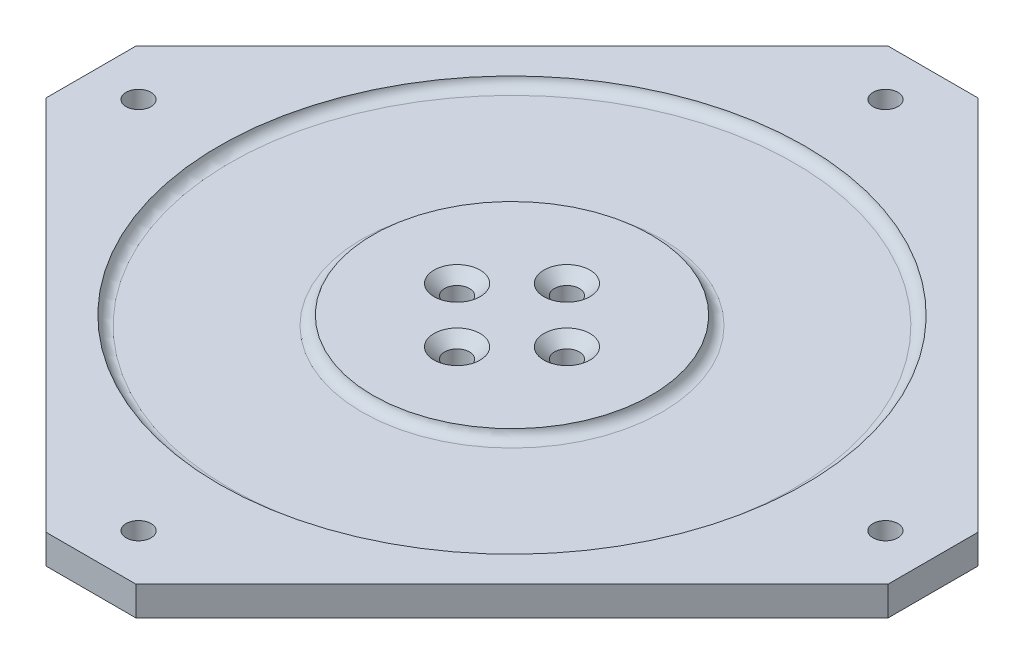
ISO-10303-21;
HEADER;
FILE_DESCRIPTION(('STEP AP214'),'2;1');
FILE_NAME('part.step','',(''),(''),'','','');
FILE_SCHEMA(('AUTOMOTIVE_DESIGN { 1 0 10303 214 1 1 1 1 }'));
ENDSEC;
DATA;
#1=APPLICATION_CONTEXT('core data for automotive mechanical design processes');
#2=APPLICATION_PROTOCOL_DEFINITION('international standard','automotive_design',2000,#1);
#3=PRODUCT_CONTEXT('',#1,'mechanical');
#4=PRODUCT('Part','Part','',(#3));
#5=PRODUCT_RELATED_PRODUCT_CATEGORY('part','',(#4));
#6=PRODUCT_DEFINITION_FORMATION('','',#4);
#7=PRODUCT_DEFINITION_CONTEXT('part definition',#1,'design');
#8=PRODUCT_DEFINITION('design','',#6,#7);
#9=PRODUCT_DEFINITION_SHAPE('','',#8);
#10=(LENGTH_UNIT() NAMED_UNIT(*) SI_UNIT(.MILLI.,.METRE.));
#11=(NAMED_UNIT(*) PLANE_ANGLE_UNIT() SI_UNIT($,.RADIAN.));
#12=(NAMED_UNIT(*) SI_UNIT($,.STERADIAN.) SOLID_ANGLE_UNIT());
#13=UNCERTAINTY_MEASURE_WITH_UNIT(LENGTH_MEASURE(1.E-05),#10,'distance_accuracy_value','');
#14=(GEOMETRIC_REPRESENTATION_CONTEXT(3) GLOBAL_UNCERTAINTY_ASSIGNED_CONTEXT((#13)) GLOBAL_UNIT_ASSIGNED_CONTEXT((#10,
#11,#12)) REPRESENTATION_CONTEXT('',''));
#15=CARTESIAN_POINT('',(0.,0.,0.));
#16=DIRECTION('',(0.,0.,1.));
#17=DIRECTION('',(1.,0.,0.));
#18=AXIS2_PLACEMENT_3D('',#15,#16,#17);
#19=CARTESIAN_POINT('',(0.,0.,0.));
#20=DIRECTION('',(0.,-1.,0.));
#21=DIRECTION('',(0.,0.,-1.));
#22=AXIS2_PLACEMENT_3D('',#19,#20,#21);
#23=PLANE('',#22);
#24=CARTESIAN_POINT('',(-7.5,0.,0.));
#25=DIRECTION('',(0.,1.,0.));
#26=DIRECTION('',(0.,0.,1.));
#27=AXIS2_PLACEMENT_3D('',#24,#25,#26);
#28=CIRCLE('',#27,1.7);
#29=CARTESIAN_POINT('',(-7.5,0.,1.70000000000001));
#30=VERTEX_POINT('',#29);
#31=EDGE_CURVE('E230',#30,#30,#28,.T.);
#32=ORIENTED_EDGE('',*,*,#31,.T.);
#33=EDGE_LOOP('',(#32));
#34=FACE_BOUND('',#33,.T.);
#35=CARTESIAN_POINT('',(0.,0.,7.50000000000001));
#36=DIRECTION('',(0.,1.,0.));
#37=DIRECTION('',(0.,0.,1.));
#38=AXIS2_PLACEMENT_3D('',#35,#36,#37);
#39=CIRCLE('',#38,1.7);
#40=CARTESIAN_POINT('',(0.,0.,9.20000000000001));
#41=VERTEX_POINT('',#40);
#42=EDGE_CURVE('E221',#41,#41,#39,.T.);
#43=ORIENTED_EDGE('',*,*,#42,.T.);
#44=EDGE_LOOP('',(#43));
#45=FACE_BOUND('',#44,.T.);
#46=CARTESIAN_POINT('',(7.5,0.,0.));
#47=DIRECTION('',(0.,1.,0.));
#48=DIRECTION('',(0.,0.,1.));
#49=AXIS2_PLACEMENT_3D('',#46,#47,#48);
#50=CIRCLE('',#49,1.7);
#51=CARTESIAN_POINT('',(7.5,0.,1.7));
#52=VERTEX_POINT('',#51);
#53=EDGE_CURVE('E212',#52,#52,#50,.T.);
#54=ORIENTED_EDGE('',*,*,#53,.T.);
#55=EDGE_LOOP('',(#54));
#56=FACE_BOUND('',#55,.T.);
#57=CARTESIAN_POINT('',(0.,0.,-7.5));
#58=DIRECTION('',(0.,1.,0.));
#59=DIRECTION('',(0.,0.,1.));
#60=AXIS2_PLACEMENT_3D('',#57,#58,#59);
#61=CIRCLE('',#60,1.7);
#62=CARTESIAN_POINT('',(0.,0.,-5.8));
#63=VERTEX_POINT('',#62);
#64=EDGE_CURVE('E203',#63,#63,#61,.T.);
#65=ORIENTED_EDGE('',*,*,#64,.T.);
#66=EDGE_LOOP('',(#65));
#67=FACE_BOUND('',#66,.T.);
#68=CARTESIAN_POINT('',(0.,0.,0.));
#69=DIRECTION('',(0.,-1.,0.));
#70=DIRECTION('',(0.,0.,-1.));
#71=AXIS2_PLACEMENT_3D('',#68,#69,#70);
#72=CIRCLE('',#71,19.);
#73=CARTESIAN_POINT('',(0.,0.,-19.));
#74=VERTEX_POINT('',#73);
#75=EDGE_CURVE('E166',#74,#74,#72,.T.);
#76=ORIENTED_EDGE('',*,*,#75,.T.);
#77=EDGE_LOOP('',(#76));
#78=FACE_BOUND('',#77,.T.);
#79=ADVANCED_FACE('F42',(#34,#45,#56,#67,#78),#23,.T.);
#80=CARTESIAN_POINT('',(0.,4.,0.));
#81=DIRECTION('',(0.,-1.,0.));
#82=DIRECTION('',(0.,0.,-1.));
#83=AXIS2_PLACEMENT_3D('',#80,#81,#82);
#84=PLANE('',#83);
#85=CARTESIAN_POINT('',(0.,4.,-7.5));
#86=DIRECTION('',(0.,1.,0.));
#87=DIRECTION('',(0.,0.,1.));
#88=AXIS2_PLACEMENT_3D('',#85,#86,#87);
#89=CIRCLE('',#88,3.15);
#90=CARTESIAN_POINT('',(0.,4.,-4.35));
#91=VERTEX_POINT('',#90);
#92=EDGE_CURVE('E197',#91,#91,#89,.T.);
#93=ORIENTED_EDGE('',*,*,#92,.F.);
#94=EDGE_LOOP('',(#93));
#95=FACE_BOUND('',#94,.T.);
#96=CARTESIAN_POINT('',(7.5,4.,0.));
#97=DIRECTION('',(0.,1.,0.));
#98=DIRECTION('',(0.,0.,1.));
#99=AXIS2_PLACEMENT_3D('',#96,#97,#98);
#100=CIRCLE('',#99,3.15);
#101=CARTESIAN_POINT('',(7.5,4.,3.15));
#102=VERTEX_POINT('',#101);
#103=EDGE_CURVE('E206',#102,#102,#100,.T.);
#104=ORIENTED_EDGE('',*,*,#103,.F.);
#105=EDGE_LOOP('',(#104));
#106=FACE_BOUND('',#105,.T.);
#107=CARTESIAN_POINT('',(0.,4.,7.50000000000001));
#108=DIRECTION('',(0.,1.,0.));
#109=DIRECTION('',(0.,0.,1.));
#110=AXIS2_PLACEMENT_3D('',#107,#108,#109);
#111=CIRCLE('',#110,3.15);
#112=CARTESIAN_POINT('',(0.,4.,10.65));
#113=VERTEX_POINT('',#112);
#114=EDGE_CURVE('E215',#113,#113,#111,.T.);
#115=ORIENTED_EDGE('',*,*,#114,.F.);
#116=EDGE_LOOP('',(#115));
#117=FACE_BOUND('',#116,.T.);
#118=CARTESIAN_POINT('',(-7.5,4.,0.));
#119=DIRECTION('',(0.,1.,0.));
#120=DIRECTION('',(0.,0.,1.));
#121=AXIS2_PLACEMENT_3D('',#118,#119,#120);
#122=CIRCLE('',#121,3.15);
#123=CARTESIAN_POINT('',(-7.5,4.,3.15000000000001));
#124=VERTEX_POINT('',#123);
#125=EDGE_CURVE('E224',#124,#124,#122,.T.);
#126=ORIENTED_EDGE('',*,*,#125,.F.);
#127=EDGE_LOOP('',(#126));
#128=FACE_BOUND('',#127,.T.);
#129=CARTESIAN_POINT('',(0.,4.,0.));
#130=DIRECTION('',(0.,1.,0.));
#131=DIRECTION('',(0.,0.,1.));
#132=AXIS2_PLACEMENT_3D('',#129,#130,#131);
#133=CIRCLE('',#132,19.);
#134=CARTESIAN_POINT('',(0.,4.,19.));
#135=VERTEX_POINT('',#134);
#136=EDGE_CURVE('E158',#135,#135,#133,.T.);
#137=ORIENTED_EDGE('',*,*,#136,.T.);
#138=EDGE_LOOP('',(#137));
#139=FACE_BOUND('',#138,.T.);
#140=ADVANCED_FACE('F308',(#95,#106,#117,#128,#139),#84,.F.);
#141=CARTESIAN_POINT('',(-63.6396103067893,4.,0.));
#142=DIRECTION('',(0.707106781186547,0.,0.707106781186547));
#143=DIRECTION('',(0.707106781186548,0.,-0.707106781186548));
#144=AXIS2_PLACEMENT_3D('',#141,#142,#143);
#145=PLANE('',#144);
#146=DIRECTION('',(-0.707106781186547,0.,0.707106781186547));
#147=VECTOR('',#146,1.);
#148=CARTESIAN_POINT('',(-63.6396103067893,4.,0.));
#149=LINE('',#148,#147);
#150=CARTESIAN_POINT('',(-6.13961030678925,4.,-57.5));
#151=VERTEX_POINT('',#150);
#152=CARTESIAN_POINT('',(-57.5,4.,-6.13961030678925));
#153=VERTEX_POINT('',#152);
#154=EDGE_CURVE('E133',#151,#153,#149,.T.);
#155=ORIENTED_EDGE('',*,*,#154,.F.);
#156=DIRECTION('',(0.,-1.,0.));
#157=VECTOR('',#156,1.);
#158=CARTESIAN_POINT('',(-6.13961030678925,4.,-57.5));
#159=LINE('',#158,#157);
#160=CARTESIAN_POINT('',(-6.13961030678925,0.,-57.5));
#161=VERTEX_POINT('',#160);
#162=EDGE_CURVE('E187',#151,#161,#159,.T.);
#163=ORIENTED_EDGE('',*,*,#162,.T.);
#164=DIRECTION('',(-0.707106781186547,0.,0.707106781186547));
#165=VECTOR('',#164,1.);
#166=CARTESIAN_POINT('',(-63.6396103067893,0.,0.));
#167=LINE('',#166,#165);
#168=CARTESIAN_POINT('',(-57.5,0.,-6.13961030678925));
#169=VERTEX_POINT('',#168);
#170=EDGE_CURVE('E135',#161,#169,#167,.T.);
#171=ORIENTED_EDGE('',*,*,#170,.T.);
#172=DIRECTION('',(0.,1.,0.));
#173=VECTOR('',#172,1.);
#174=CARTESIAN_POINT('',(-57.5,4.,-6.13961030678925));
#175=LINE('',#174,#173);
#176=EDGE_CURVE('E178',#169,#153,#175,.T.);
#177=ORIENTED_EDGE('',*,*,#176,.T.);
#178=EDGE_LOOP('',(#155,#163,#171,#177));
#179=FACE_BOUND('',#178,.T.);
#180=ADVANCED_FACE('F280',(#179),#145,.F.);
#181=CARTESIAN_POINT('',(-63.6396103067893,4.,0.));
#182=DIRECTION('',(0.707106781186547,0.,-0.707106781186547));
#183=DIRECTION('',(-0.707106781186548,0.,-0.707106781186548));
#184=AXIS2_PLACEMENT_3D('',#181,#182,#183);
#185=PLANE('',#184);
#186=DIRECTION('',(0.707106781186547,0.,0.707106781186547));
#187=VECTOR('',#186,1.);
#188=CARTESIAN_POINT('',(-63.6396103067893,4.,0.));
#189=LINE('',#188,#187);
#190=CARTESIAN_POINT('',(-57.5,4.,6.13961030678929));
#191=VERTEX_POINT('',#190);
#192=CARTESIAN_POINT('',(-6.13961030678931,4.,57.5));
#193=VERTEX_POINT('',#192);
#194=EDGE_CURVE('E271',#191,#193,#189,.T.);
#195=ORIENTED_EDGE('',*,*,#194,.F.);
#196=DIRECTION('',(0.,-1.,0.));
#197=VECTOR('',#196,1.);
#198=CARTESIAN_POINT('',(-57.5,4.,6.13961030678929));
#199=LINE('',#198,#197);
#200=CARTESIAN_POINT('',(-57.5,0.,6.13961030678929));
#201=VERTEX_POINT('',#200);
#202=EDGE_CURVE('E175',#191,#201,#199,.T.);
#203=ORIENTED_EDGE('',*,*,#202,.T.);
#204=DIRECTION('',(0.707106781186547,0.,0.707106781186547));
#205=VECTOR('',#204,1.);
#206=CARTESIAN_POINT('',(-63.6396103067893,0.,0.));
#207=LINE('',#206,#205);
#208=CARTESIAN_POINT('',(-6.13961030678931,0.,57.5));
#209=VERTEX_POINT('',#208);
#210=EDGE_CURVE('E130',#201,#209,#207,.T.);
#211=ORIENTED_EDGE('',*,*,#210,.T.);
#212=DIRECTION('',(0.,1.,0.));
#213=VECTOR('',#212,1.);
#214=CARTESIAN_POINT('',(-6.1396103067893,4.,57.5));
#215=LINE('',#214,#213);
#216=EDGE_CURVE('E57',#209,#193,#215,.T.);
#217=ORIENTED_EDGE('',*,*,#216,.T.);
#218=EDGE_LOOP('',(#195,#203,#211,#217));
#219=FACE_BOUND('',#218,.T.);
#220=ADVANCED_FACE('F287',(#219),#185,.F.);
#221=CARTESIAN_POINT('',(0.,4.,63.6396103067893));
#222=DIRECTION('',(-0.707106781186547,0.,-0.707106781186547));
#223=DIRECTION('',(-0.707106781186548,0.,0.707106781186548));
#224=AXIS2_PLACEMENT_3D('',#221,#222,#223);
#225=PLANE('',#224);
#226=DIRECTION('',(0.707106781186547,0.,-0.707106781186547));
#227=VECTOR('',#226,1.);
#228=CARTESIAN_POINT('',(0.,0.,63.6396103067893));
#229=LINE('',#228,#227);
#230=CARTESIAN_POINT('',(6.13961030678927,0.,57.5));
#231=VERTEX_POINT('',#230);
#232=CARTESIAN_POINT('',(57.5,0.,6.13961030678926));
#233=VERTEX_POINT('',#232);
#234=EDGE_CURVE('E120',#231,#233,#229,.T.);
#235=ORIENTED_EDGE('',*,*,#234,.T.);
#236=DIRECTION('',(0.,1.,0.));
#237=VECTOR('',#236,1.);
#238=CARTESIAN_POINT('',(57.5,4.,6.13961030678927));
#239=LINE('',#238,#237);
#240=CARTESIAN_POINT('',(57.5,4.,6.13961030678926));
#241=VERTEX_POINT('',#240);
#242=EDGE_CURVE('E65',#233,#241,#239,.T.);
#243=ORIENTED_EDGE('',*,*,#242,.T.);
#244=DIRECTION('',(0.707106781186547,0.,-0.707106781186547));
#245=VECTOR('',#244,1.);
#246=CARTESIAN_POINT('',(0.,4.,63.6396103067893));
#247=LINE('',#246,#245);
#248=CARTESIAN_POINT('',(6.13961030678928,4.,57.5));
#249=VERTEX_POINT('',#248);
#250=EDGE_CURVE('E122',#249,#241,#247,.T.);
#251=ORIENTED_EDGE('',*,*,#250,.F.);
#252=DIRECTION('',(0.,-1.,0.));
#253=VECTOR('',#252,1.);
#254=CARTESIAN_POINT('',(6.13961030678928,4.,57.5));
#255=LINE('',#254,#253);
#256=EDGE_CURVE('E107',#249,#231,#255,.T.);
#257=ORIENTED_EDGE('',*,*,#256,.T.);
#258=EDGE_LOOP('',(#235,#243,#251,#257));
#259=FACE_BOUND('',#258,.T.);
#260=ADVANCED_FACE('F119',(#259),#225,.F.);
#261=CARTESIAN_POINT('',(0.,4.,-63.6396103067892));
#262=DIRECTION('',(-0.707106781186548,0.,0.707106781186547));
#263=DIRECTION('',(0.707106781186547,0.,0.707106781186548));
#264=AXIS2_PLACEMENT_3D('',#261,#262,#263);
#265=PLANE('',#264);
#266=DIRECTION('',(-0.707106781186547,0.,-0.707106781186548));
#267=VECTOR('',#266,1.);
#268=CARTESIAN_POINT('',(0.,4.,-63.6396103067892));
#269=LINE('',#268,#267);
#270=CARTESIAN_POINT('',(57.5,4.,-6.13961030678922));
#271=VERTEX_POINT('',#270);
#272=CARTESIAN_POINT('',(6.13961030678924,4.,-57.5));
#273=VERTEX_POINT('',#272);
#274=EDGE_CURVE('E114',#271,#273,#269,.T.);
#275=ORIENTED_EDGE('',*,*,#274,.F.);
#276=DIRECTION('',(0.,-1.,0.));
#277=VECTOR('',#276,1.);
#278=CARTESIAN_POINT('',(57.5,4.,-6.13961030678922));
#279=LINE('',#278,#277);
#280=CARTESIAN_POINT('',(57.5,0.,-6.13961030678922));
#281=VERTEX_POINT('',#280);
#282=EDGE_CURVE('E193',#271,#281,#279,.T.);
#283=ORIENTED_EDGE('',*,*,#282,.T.);
#284=DIRECTION('',(-0.707106781186547,0.,-0.707106781186548));
#285=VECTOR('',#284,1.);
#286=CARTESIAN_POINT('',(0.,0.,-63.6396103067892));
#287=LINE('',#286,#285);
#288=CARTESIAN_POINT('',(6.13961030678924,0.,-57.5));
#289=VERTEX_POINT('',#288);
#290=EDGE_CURVE('E129',#281,#289,#287,.T.);
#291=ORIENTED_EDGE('',*,*,#290,.T.);
#292=DIRECTION('',(0.,1.,0.));
#293=VECTOR('',#292,1.);
#294=CARTESIAN_POINT('',(6.13961030678924,4.,-57.5));
#295=LINE('',#294,#293);
#296=EDGE_CURVE('E184',#289,#273,#295,.T.);
#297=ORIENTED_EDGE('',*,*,#296,.T.);
#298=EDGE_LOOP('',(#275,#283,#291,#297));
#299=FACE_BOUND('',#298,.T.);
#300=ADVANCED_FACE('F294',(#299),#265,.F.);
#301=CARTESIAN_POINT('',(0.,4.,0.));
#302=DIRECTION('',(0.,1.,0.));
#303=DIRECTION('',(0.,0.,1.));
#304=AXIS2_PLACEMENT_3D('',#301,#302,#303);
#305=CIRCLE('',#304,40.);
#306=CARTESIAN_POINT('',(0.,4.,40.));
#307=VERTEX_POINT('',#306);
#308=EDGE_CURVE('E160',#307,#307,#305,.T.);
#309=ORIENTED_EDGE('',*,*,#308,.F.);
#310=EDGE_LOOP('',(#309));
#311=FACE_BOUND('',#310,.T.);
#312=CARTESIAN_POINT('',(-51.,4.,0.));
#313=DIRECTION('',(0.,-1.,0.));
#314=DIRECTION('',(0.,0.,-1.));
#315=AXIS2_PLACEMENT_3D('',#312,#313,#314);
#316=CIRCLE('',#315,1.69999999999999);
#317=CARTESIAN_POINT('',(-51.,4.,-1.69999999999999));
#318=VERTEX_POINT('',#317);
#319=EDGE_CURVE('E239',#318,#318,#316,.T.);
#320=ORIENTED_EDGE('',*,*,#319,.T.);
#321=EDGE_LOOP('',(#320));
#322=FACE_BOUND('',#321,.T.);
#323=CARTESIAN_POINT('',(0.,4.,51.));
#324=DIRECTION('',(0.,-1.,0.));
#325=DIRECTION('',(0.,0.,-1.));
#326=AXIS2_PLACEMENT_3D('',#323,#324,#325);
#327=CIRCLE('',#326,1.69999999999999);
#328=CARTESIAN_POINT('',(0.,4.,49.3));
#329=VERTEX_POINT('',#328);
#330=EDGE_CURVE('E248',#329,#329,#327,.T.);
#331=ORIENTED_EDGE('',*,*,#330,.T.);
#332=EDGE_LOOP('',(#331));
#333=FACE_BOUND('',#332,.T.);
#334=CARTESIAN_POINT('',(51.,4.,0.));
#335=DIRECTION('',(0.,-1.,0.));
#336=DIRECTION('',(0.,0.,-1.));
#337=AXIS2_PLACEMENT_3D('',#334,#335,#336);
#338=CIRCLE('',#337,1.69999999999999);
#339=CARTESIAN_POINT('',(51.,4.,-1.69999999999999));
#340=VERTEX_POINT('',#339);
#341=EDGE_CURVE('E257',#340,#340,#338,.T.);
#342=ORIENTED_EDGE('',*,*,#341,.T.);
#343=EDGE_LOOP('',(#342));
#344=FACE_BOUND('',#343,.T.);
#345=CARTESIAN_POINT('',(0.,4.,-51.));
#346=DIRECTION('',(0.,-1.,0.));
#347=DIRECTION('',(0.,0.,-1.));
#348=AXIS2_PLACEMENT_3D('',#345,#346,#347);
#349=CIRCLE('',#348,1.69999999999999);
#350=CARTESIAN_POINT('',(0.,4.,-52.7));
#351=VERTEX_POINT('',#350);
#352=EDGE_CURVE('E266',#351,#351,#349,.T.);
#353=ORIENTED_EDGE('',*,*,#352,.T.);
#354=EDGE_LOOP('',(#353));
#355=FACE_BOUND('',#354,.T.);
#356=ORIENTED_EDGE('',*,*,#250,.T.);
#357=DIRECTION('',(0.,0.,-1.));
#358=VECTOR('',#357,1.);
#359=CARTESIAN_POINT('',(57.5,4.,0.));
#360=LINE('',#359,#358);
#361=EDGE_CURVE('E190',#241,#271,#360,.T.);
#362=ORIENTED_EDGE('',*,*,#361,.T.);
#363=ORIENTED_EDGE('',*,*,#274,.T.);
#364=DIRECTION('',(-1.,0.,0.));
#365=VECTOR('',#364,1.);
#366=CARTESIAN_POINT('',(0.,4.,-57.5));
#367=LINE('',#366,#365);
#368=EDGE_CURVE('E181',#273,#151,#367,.T.);
#369=ORIENTED_EDGE('',*,*,#368,.T.);
#370=ORIENTED_EDGE('',*,*,#154,.T.);
#371=DIRECTION('',(0.,0.,1.));
#372=VECTOR('',#371,1.);
#373=CARTESIAN_POINT('',(-57.5,4.,0.));
#374=LINE('',#373,#372);
#375=EDGE_CURVE('E172',#153,#191,#374,.T.);
#376=ORIENTED_EDGE('',*,*,#375,.T.);
#377=ORIENTED_EDGE('',*,*,#194,.T.);
#378=DIRECTION('',(1.,0.,0.));
#379=VECTOR('',#378,1.);
#380=CARTESIAN_POINT('',(0.,4.,57.5));
#381=LINE('',#380,#379);
#382=EDGE_CURVE('E123',#193,#249,#381,.T.);
#383=ORIENTED_EDGE('',*,*,#382,.T.);
#384=EDGE_LOOP('',(#356,#362,#363,#369,#370,#376,#377,#383));
#385=FACE_BOUND('',#384,.T.);
#386=ADVANCED_FACE('F289',(#311,#322,#333,#344,#355,#385),#84,.F.);
#387=CARTESIAN_POINT('',(0.,0.,0.));
#388=DIRECTION('',(0.,-1.,0.));
#389=DIRECTION('',(0.,0.,-1.));
#390=AXIS2_PLACEMENT_3D('',#387,#388,#389);
#391=CIRCLE('',#390,40.);
#392=CARTESIAN_POINT('',(0.,0.,-40.));
#393=VERTEX_POINT('',#392);
#394=EDGE_CURVE('E161',#393,#393,#391,.T.);
#395=ORIENTED_EDGE('',*,*,#394,.F.);
#396=EDGE_LOOP('',(#395));
#397=FACE_BOUND('',#396,.T.);
#398=DIRECTION('',(0.,0.,-1.));
#399=VECTOR('',#398,1.);
#400=CARTESIAN_POINT('',(57.5,0.,0.));
#401=LINE('',#400,#399);
#402=EDGE_CURVE('E128',#233,#281,#401,.T.);
#403=ORIENTED_EDGE('',*,*,#402,.F.);
#404=ORIENTED_EDGE('',*,*,#234,.F.);
#405=DIRECTION('',(1.,0.,0.));
#406=VECTOR('',#405,1.);
#407=CARTESIAN_POINT('',(0.,0.,57.5));
#408=LINE('',#407,#406);
#409=EDGE_CURVE('E104',#209,#231,#408,.T.);
#410=ORIENTED_EDGE('',*,*,#409,.F.);
#411=ORIENTED_EDGE('',*,*,#210,.F.);
#412=DIRECTION('',(0.,0.,1.));
#413=VECTOR('',#412,1.);
#414=CARTESIAN_POINT('',(-57.5,0.,0.));
#415=LINE('',#414,#413);
#416=EDGE_CURVE('E113',#169,#201,#415,.T.);
#417=ORIENTED_EDGE('',*,*,#416,.F.);
#418=ORIENTED_EDGE('',*,*,#170,.F.);
#419=DIRECTION('',(-1.,0.,0.));
#420=VECTOR('',#419,1.);
#421=CARTESIAN_POINT('',(0.,0.,-57.5));
#422=LINE('',#421,#420);
#423=EDGE_CURVE('E140',#289,#161,#422,.T.);
#424=ORIENTED_EDGE('',*,*,#423,.F.);
#425=ORIENTED_EDGE('',*,*,#290,.F.);
#426=EDGE_LOOP('',(#403,#404,#410,#411,#417,#418,#424,#425));
#427=FACE_BOUND('',#426,.T.);
#428=CARTESIAN_POINT('',(-51.,0.,0.));
#429=DIRECTION('',(0.,-1.,0.));
#430=DIRECTION('',(0.,0.,-1.));
#431=AXIS2_PLACEMENT_3D('',#428,#429,#430);
#432=CIRCLE('',#431,3.15);
#433=CARTESIAN_POINT('',(-51.,0.,-3.15));
#434=VERTEX_POINT('',#433);
#435=EDGE_CURVE('E233',#434,#434,#432,.T.);
#436=ORIENTED_EDGE('',*,*,#435,.F.);
#437=EDGE_LOOP('',(#436));
#438=FACE_BOUND('',#437,.T.);
#439=CARTESIAN_POINT('',(0.,0.,51.));
#440=DIRECTION('',(0.,-1.,0.));
#441=DIRECTION('',(0.,0.,-1.));
#442=AXIS2_PLACEMENT_3D('',#439,#440,#441);
#443=CIRCLE('',#442,3.15);
#444=CARTESIAN_POINT('',(0.,0.,47.85));
#445=VERTEX_POINT('',#444);
#446=EDGE_CURVE('E242',#445,#445,#443,.T.);
#447=ORIENTED_EDGE('',*,*,#446,.F.);
#448=EDGE_LOOP('',(#447));
#449=FACE_BOUND('',#448,.T.);
#450=CARTESIAN_POINT('',(51.,0.,0.));
#451=DIRECTION('',(0.,-1.,0.));
#452=DIRECTION('',(0.,0.,-1.));
#453=AXIS2_PLACEMENT_3D('',#450,#451,#452);
#454=CIRCLE('',#453,3.15);
#455=CARTESIAN_POINT('',(51.,0.,-3.15));
#456=VERTEX_POINT('',#455);
#457=EDGE_CURVE('E251',#456,#456,#454,.T.);
#458=ORIENTED_EDGE('',*,*,#457,.F.);
#459=EDGE_LOOP('',(#458));
#460=FACE_BOUND('',#459,.T.);
#461=CARTESIAN_POINT('',(0.,0.,-51.));
#462=DIRECTION('',(0.,-1.,0.));
#463=DIRECTION('',(0.,0.,-1.));
#464=AXIS2_PLACEMENT_3D('',#461,#462,#463);
#465=CIRCLE('',#464,3.15);
#466=CARTESIAN_POINT('',(0.,0.,-54.15));
#467=VERTEX_POINT('',#466);
#468=EDGE_CURVE('E260',#467,#467,#465,.T.);
#469=ORIENTED_EDGE('',*,*,#468,.F.);
#470=EDGE_LOOP('',(#469));
#471=FACE_BOUND('',#470,.T.);
#472=ADVANCED_FACE('F125',(#397,#427,#438,#449,#460,#471),#23,.T.);
#473=CARTESIAN_POINT('',(0.,0.,-51.));
#474=DIRECTION('',(0.,-1.,0.));
#475=DIRECTION('',(0.,0.,-1.));
#476=AXIS2_PLACEMENT_3D('',#473,#474,#475);
#477=CYLINDRICAL_SURFACE('',#476,1.69999999999999);
#478=ORIENTED_EDGE('',*,*,#352,.F.);
#479=EDGE_LOOP('',(#478));
#480=FACE_BOUND('',#479,.T.);
#481=CARTESIAN_POINT('',(0.,1.45,-51.));
#482=DIRECTION('',(0.,-1.,0.));
#483=DIRECTION('',(0.,0.,-1.));
#484=AXIS2_PLACEMENT_3D('',#481,#482,#483);
#485=CIRCLE('',#484,1.7);
#486=CARTESIAN_POINT('',(0.,1.45,-52.7));
#487=VERTEX_POINT('',#486);
#488=EDGE_CURVE('E263',#487,#487,#485,.T.);
#489=ORIENTED_EDGE('',*,*,#488,.T.);
#490=EDGE_LOOP('',(#489));
#491=FACE_BOUND('',#490,.T.);
#492=ADVANCED_FACE('F319',(#480,#491),#477,.F.);
#493=CARTESIAN_POINT('',(0.,0.,-51.));
#494=DIRECTION('',(0.,-1.,0.));
#495=DIRECTION('',(0.,0.,-1.));
#496=AXIS2_PLACEMENT_3D('',#493,#494,#495);
#497=CONICAL_SURFACE('',#496,3.15,0.785398163397448);
#498=ORIENTED_EDGE('',*,*,#488,.F.);
#499=EDGE_LOOP('',(#498));
#500=FACE_BOUND('',#499,.T.);
#501=ORIENTED_EDGE('',*,*,#468,.T.);
#502=EDGE_LOOP('',(#501));
#503=FACE_BOUND('',#502,.T.);
#504=ADVANCED_FACE('F325',(#500,#503),#497,.F.);
#505=CARTESIAN_POINT('',(51.,0.,0.));
#506=DIRECTION('',(0.,-1.,0.));
#507=DIRECTION('',(0.,0.,-1.));
#508=AXIS2_PLACEMENT_3D('',#505,#506,#507);
#509=CYLINDRICAL_SURFACE('',#508,1.69999999999999);
#510=ORIENTED_EDGE('',*,*,#341,.F.);
#511=EDGE_LOOP('',(#510));
#512=FACE_BOUND('',#511,.T.);
#513=CARTESIAN_POINT('',(51.,1.45,0.));
#514=DIRECTION('',(0.,-1.,0.));
#515=DIRECTION('',(0.,0.,-1.));
#516=AXIS2_PLACEMENT_3D('',#513,#514,#515);
#517=CIRCLE('',#516,1.7);
#518=CARTESIAN_POINT('',(51.,1.45,-1.7));
#519=VERTEX_POINT('',#518);
#520=EDGE_CURVE('E254',#519,#519,#517,.T.);
#521=ORIENTED_EDGE('',*,*,#520,.T.);
#522=EDGE_LOOP('',(#521));
#523=FACE_BOUND('',#522,.T.);
#524=ADVANCED_FACE('F558',(#512,#523),#509,.F.);
#525=CARTESIAN_POINT('',(51.,0.,0.));
#526=DIRECTION('',(0.,-1.,0.));
#527=DIRECTION('',(0.,0.,-1.));
#528=AXIS2_PLACEMENT_3D('',#525,#526,#527);
#529=CONICAL_SURFACE('',#528,3.15,0.785398163397447);
#530=ORIENTED_EDGE('',*,*,#520,.F.);
#531=EDGE_LOOP('',(#530));
#532=FACE_BOUND('',#531,.T.);
#533=ORIENTED_EDGE('',*,*,#457,.T.);
#534=EDGE_LOOP('',(#533));
#535=FACE_BOUND('',#534,.T.);
#536=ADVANCED_FACE('F549',(#532,#535),#529,.F.);
#537=CARTESIAN_POINT('',(0.,0.,51.));
#538=DIRECTION('',(0.,-1.,0.));
#539=DIRECTION('',(0.,0.,-1.));
#540=AXIS2_PLACEMENT_3D('',#537,#538,#539);
#541=CYLINDRICAL_SURFACE('',#540,1.69999999999999);
#542=ORIENTED_EDGE('',*,*,#330,.F.);
#543=EDGE_LOOP('',(#542));
#544=FACE_BOUND('',#543,.T.);
#545=CARTESIAN_POINT('',(0.,1.45,51.));
#546=DIRECTION('',(0.,-1.,0.));
#547=DIRECTION('',(0.,0.,-1.));
#548=AXIS2_PLACEMENT_3D('',#545,#546,#547);
#549=CIRCLE('',#548,1.7);
#550=CARTESIAN_POINT('',(0.,1.45,49.3));
#551=VERTEX_POINT('',#550);
#552=EDGE_CURVE('E245',#551,#551,#549,.T.);
#553=ORIENTED_EDGE('',*,*,#552,.T.);
#554=EDGE_LOOP('',(#553));
#555=FACE_BOUND('',#554,.T.);
#556=ADVANCED_FACE('F540',(#544,#555),#541,.F.);
#557=CARTESIAN_POINT('',(0.,0.,51.));
#558=DIRECTION('',(0.,-1.,0.));
#559=DIRECTION('',(0.,0.,-1.));
#560=AXIS2_PLACEMENT_3D('',#557,#558,#559);
#561=CONICAL_SURFACE('',#560,3.15,0.785398163397448);
#562=ORIENTED_EDGE('',*,*,#552,.F.);
#563=EDGE_LOOP('',(#562));
#564=FACE_BOUND('',#563,.T.);
#565=ORIENTED_EDGE('',*,*,#446,.T.);
#566=EDGE_LOOP('',(#565));
#567=FACE_BOUND('',#566,.T.);
#568=ADVANCED_FACE('F531',(#564,#567),#561,.F.);
#569=CARTESIAN_POINT('',(-51.,0.,0.));
#570=DIRECTION('',(0.,-1.,0.));
#571=DIRECTION('',(0.,0.,-1.));
#572=AXIS2_PLACEMENT_3D('',#569,#570,#571);
#573=CYLINDRICAL_SURFACE('',#572,1.69999999999999);
#574=ORIENTED_EDGE('',*,*,#319,.F.);
#575=EDGE_LOOP('',(#574));
#576=FACE_BOUND('',#575,.T.);
#577=CARTESIAN_POINT('',(-51.,1.45,0.));
#578=DIRECTION('',(0.,-1.,0.));
#579=DIRECTION('',(0.,0.,-1.));
#580=AXIS2_PLACEMENT_3D('',#577,#578,#579);
#581=CIRCLE('',#580,1.7);
#582=CARTESIAN_POINT('',(-51.,1.45,-1.7));
#583=VERTEX_POINT('',#582);
#584=EDGE_CURVE('E236',#583,#583,#581,.T.);
#585=ORIENTED_EDGE('',*,*,#584,.T.);
#586=EDGE_LOOP('',(#585));
#587=FACE_BOUND('',#586,.T.);
#588=ADVANCED_FACE('F522',(#576,#587),#573,.F.);
#589=CARTESIAN_POINT('',(-51.,0.,0.));
#590=DIRECTION('',(0.,-1.,0.));
#591=DIRECTION('',(0.,0.,-1.));
#592=AXIS2_PLACEMENT_3D('',#589,#590,#591);
#593=CONICAL_SURFACE('',#592,3.15,0.785398163397447);
#594=ORIENTED_EDGE('',*,*,#584,.F.);
#595=EDGE_LOOP('',(#594));
#596=FACE_BOUND('',#595,.T.);
#597=ORIENTED_EDGE('',*,*,#435,.T.);
#598=EDGE_LOOP('',(#597));
#599=FACE_BOUND('',#598,.T.);
#600=ADVANCED_FACE('F513',(#596,#599),#593,.F.);
#601=CARTESIAN_POINT('',(-7.5,4.,0.));
#602=DIRECTION('',(0.,1.,0.));
#603=DIRECTION('',(0.,0.,1.));
#604=AXIS2_PLACEMENT_3D('',#601,#602,#603);
#605=CYLINDRICAL_SURFACE('',#604,1.7);
#606=ORIENTED_EDGE('',*,*,#31,.F.);
#607=EDGE_LOOP('',(#606));
#608=FACE_BOUND('',#607,.T.);
#609=CARTESIAN_POINT('',(-7.5,2.55,0.));
#610=DIRECTION('',(0.,1.,0.));
#611=DIRECTION('',(0.,0.,1.));
#612=AXIS2_PLACEMENT_3D('',#609,#610,#611);
#613=CIRCLE('',#612,1.7);
#614=CARTESIAN_POINT('',(-7.5,2.55,1.70000000000001));
#615=VERTEX_POINT('',#614);
#616=EDGE_CURVE('E227',#615,#615,#613,.T.);
#617=ORIENTED_EDGE('',*,*,#616,.T.);
#618=EDGE_LOOP('',(#617));
#619=FACE_BOUND('',#618,.T.);
#620=ADVANCED_FACE('F504',(#608,#619),#605,.F.);
#621=CARTESIAN_POINT('',(-7.5,4.,0.));
#622=DIRECTION('',(0.,1.,0.));
#623=DIRECTION('',(0.,0.,1.));
#624=AXIS2_PLACEMENT_3D('',#621,#622,#623);
#625=CONICAL_SURFACE('',#624,3.15,0.785398163397449);
#626=ORIENTED_EDGE('',*,*,#616,.F.);
#627=EDGE_LOOP('',(#626));
#628=FACE_BOUND('',#627,.T.);
#629=ORIENTED_EDGE('',*,*,#125,.T.);
#630=EDGE_LOOP('',(#629));
#631=FACE_BOUND('',#630,.T.);
#632=ADVANCED_FACE('F495',(#628,#631),#625,.F.);
#633=CARTESIAN_POINT('',(0.,4.,7.50000000000001));
#634=DIRECTION('',(0.,1.,0.));
#635=DIRECTION('',(0.,0.,1.));
#636=AXIS2_PLACEMENT_3D('',#633,#634,#635);
#637=CYLINDRICAL_SURFACE('',#636,1.7);
#638=ORIENTED_EDGE('',*,*,#42,.F.);
#639=EDGE_LOOP('',(#638));
#640=FACE_BOUND('',#639,.T.);
#641=CARTESIAN_POINT('',(0.,2.55,7.50000000000001));
#642=DIRECTION('',(0.,1.,0.));
#643=DIRECTION('',(0.,0.,1.));
#644=AXIS2_PLACEMENT_3D('',#641,#642,#643);
#645=CIRCLE('',#644,1.7);
#646=CARTESIAN_POINT('',(0.,2.55,9.20000000000001));
#647=VERTEX_POINT('',#646);
#648=EDGE_CURVE('E218',#647,#647,#645,.T.);
#649=ORIENTED_EDGE('',*,*,#648,.T.);
#650=EDGE_LOOP('',(#649));
#651=FACE_BOUND('',#650,.T.);
#652=ADVANCED_FACE('F486',(#640,#651),#637,.F.);
#653=CARTESIAN_POINT('',(0.,4.,7.50000000000001));
#654=DIRECTION('',(0.,1.,0.));
#655=DIRECTION('',(0.,0.,1.));
#656=AXIS2_PLACEMENT_3D('',#653,#654,#655);
#657=CONICAL_SURFACE('',#656,3.15,0.785398163397449);
#658=ORIENTED_EDGE('',*,*,#648,.F.);
#659=EDGE_LOOP('',(#658));
#660=FACE_BOUND('',#659,.T.);
#661=ORIENTED_EDGE('',*,*,#114,.T.);
#662=EDGE_LOOP('',(#661));
#663=FACE_BOUND('',#662,.T.);
#664=ADVANCED_FACE('F477',(#660,#663),#657,.F.);
#665=CARTESIAN_POINT('',(7.5,4.,0.));
#666=DIRECTION('',(0.,1.,0.));
#667=DIRECTION('',(0.,0.,1.));
#668=AXIS2_PLACEMENT_3D('',#665,#666,#667);
#669=CYLINDRICAL_SURFACE('',#668,1.7);
#670=ORIENTED_EDGE('',*,*,#53,.F.);
#671=EDGE_LOOP('',(#670));
#672=FACE_BOUND('',#671,.T.);
#673=CARTESIAN_POINT('',(7.5,2.55,0.));
#674=DIRECTION('',(0.,1.,0.));
#675=DIRECTION('',(0.,0.,1.));
#676=AXIS2_PLACEMENT_3D('',#673,#674,#675);
#677=CIRCLE('',#676,1.7);
#678=CARTESIAN_POINT('',(7.5,2.55,1.7));
#679=VERTEX_POINT('',#678);
#680=EDGE_CURVE('E209',#679,#679,#677,.T.);
#681=ORIENTED_EDGE('',*,*,#680,.T.);
#682=EDGE_LOOP('',(#681));
#683=FACE_BOUND('',#682,.T.);
#684=ADVANCED_FACE('F468',(#672,#683),#669,.F.);
#685=CARTESIAN_POINT('',(7.5,4.,0.));
#686=DIRECTION('',(0.,1.,0.));
#687=DIRECTION('',(0.,0.,1.));
#688=AXIS2_PLACEMENT_3D('',#685,#686,#687);
#689=CONICAL_SURFACE('',#688,3.15,0.785398163397449);
#690=ORIENTED_EDGE('',*,*,#680,.F.);
#691=EDGE_LOOP('',(#690));
#692=FACE_BOUND('',#691,.T.);
#693=ORIENTED_EDGE('',*,*,#103,.T.);
#694=EDGE_LOOP('',(#693));
#695=FACE_BOUND('',#694,.T.);
#696=ADVANCED_FACE('F459',(#692,#695),#689,.F.);
#697=CARTESIAN_POINT('',(0.,4.,-7.5));
#698=DIRECTION('',(0.,1.,0.));
#699=DIRECTION('',(0.,0.,1.));
#700=AXIS2_PLACEMENT_3D('',#697,#698,#699);
#701=CYLINDRICAL_SURFACE('',#700,1.7);
#702=ORIENTED_EDGE('',*,*,#64,.F.);
#703=EDGE_LOOP('',(#702));
#704=FACE_BOUND('',#703,.T.);
#705=CARTESIAN_POINT('',(0.,2.55,-7.5));
#706=DIRECTION('',(0.,1.,0.));
#707=DIRECTION('',(0.,0.,1.));
#708=AXIS2_PLACEMENT_3D('',#705,#706,#707);
#709=CIRCLE('',#708,1.7);
#710=CARTESIAN_POINT('',(0.,2.55,-5.8));
#711=VERTEX_POINT('',#710);
#712=EDGE_CURVE('E200',#711,#711,#709,.T.);
#713=ORIENTED_EDGE('',*,*,#712,.T.);
#714=EDGE_LOOP('',(#713));
#715=FACE_BOUND('',#714,.T.);
#716=ADVANCED_FACE('F450',(#704,#715),#701,.F.);
#717=CARTESIAN_POINT('',(0.,4.,-7.5));
#718=DIRECTION('',(0.,1.,0.));
#719=DIRECTION('',(0.,0.,1.));
#720=AXIS2_PLACEMENT_3D('',#717,#718,#719);
#721=CONICAL_SURFACE('',#720,3.15,0.785398163397449);
#722=ORIENTED_EDGE('',*,*,#712,.F.);
#723=EDGE_LOOP('',(#722));
#724=FACE_BOUND('',#723,.T.);
#725=ORIENTED_EDGE('',*,*,#92,.T.);
#726=EDGE_LOOP('',(#725));
#727=FACE_BOUND('',#726,.T.);
#728=ADVANCED_FACE('F442',(#724,#727),#721,.F.);
#729=CARTESIAN_POINT('',(-57.5,20.,57.5));
#730=DIRECTION('',(0.,0.,-1.));
#731=DIRECTION('',(-1.,0.,0.));
#732=AXIS2_PLACEMENT_3D('',#729,#730,#731);
#733=PLANE('',#732);
#734=ORIENTED_EDGE('',*,*,#409,.T.);
#735=ORIENTED_EDGE('',*,*,#256,.F.);
#736=ORIENTED_EDGE('',*,*,#382,.F.);
#737=ORIENTED_EDGE('',*,*,#216,.F.);
#738=EDGE_LOOP('',(#734,#735,#736,#737));
#739=FACE_BOUND('',#738,.T.);
#740=ADVANCED_FACE('F106',(#739),#733,.F.);
#741=CARTESIAN_POINT('',(-57.5,20.,57.5));
#742=DIRECTION('',(1.,0.,0.));
#743=DIRECTION('',(0.,0.,-1.));
#744=AXIS2_PLACEMENT_3D('',#741,#742,#743);
#745=PLANE('',#744);
#746=ORIENTED_EDGE('',*,*,#416,.T.);
#747=ORIENTED_EDGE('',*,*,#202,.F.);
#748=ORIENTED_EDGE('',*,*,#375,.F.);
#749=ORIENTED_EDGE('',*,*,#176,.F.);
#750=EDGE_LOOP('',(#746,#747,#748,#749));
#751=FACE_BOUND('',#750,.T.);
#752=ADVANCED_FACE('F284',(#751),#745,.F.);
#753=CARTESIAN_POINT('',(-57.5,20.,-57.5));
#754=DIRECTION('',(0.,0.,1.));
#755=DIRECTION('',(1.,0.,0.));
#756=AXIS2_PLACEMENT_3D('',#753,#754,#755);
#757=PLANE('',#756);
#758=ORIENTED_EDGE('',*,*,#368,.F.);
#759=ORIENTED_EDGE('',*,*,#296,.F.);
#760=ORIENTED_EDGE('',*,*,#423,.T.);
#761=ORIENTED_EDGE('',*,*,#162,.F.);
#762=EDGE_LOOP('',(#758,#759,#760,#761));
#763=FACE_BOUND('',#762,.T.);
#764=ADVANCED_FACE('F292',(#763),#757,.F.);
#765=CARTESIAN_POINT('',(57.5,20.,57.5));
#766=DIRECTION('',(-1.,0.,0.));
#767=DIRECTION('',(0.,0.,1.));
#768=AXIS2_PLACEMENT_3D('',#765,#766,#767);
#769=PLANE('',#768);
#770=ORIENTED_EDGE('',*,*,#402,.T.);
#771=ORIENTED_EDGE('',*,*,#282,.F.);
#772=ORIENTED_EDGE('',*,*,#361,.F.);
#773=ORIENTED_EDGE('',*,*,#242,.F.);
#774=EDGE_LOOP('',(#770,#771,#772,#773));
#775=FACE_BOUND('',#774,.T.);
#776=ADVANCED_FACE('F295',(#775),#769,.F.);
#777=CARTESIAN_POINT('',(0.,2.75,0.));
#778=DIRECTION('',(0.,1.,0.));
#779=DIRECTION('',(0.,0.,1.));
#780=AXIS2_PLACEMENT_3D('',#777,#778,#779);
#781=PLANE('',#780);
#782=CARTESIAN_POINT('',(0.,2.75,0.));
#783=DIRECTION('',(0.,1.,0.));
#784=DIRECTION('',(0.,0.,1.));
#785=AXIS2_PLACEMENT_3D('',#782,#783,#784);
#786=CIRCLE('',#785,38.5209800542251);
#787=CARTESIAN_POINT('',(0.,2.75,38.5209800542251));
#788=VERTEX_POINT('',#787);
#789=EDGE_CURVE('E13',#788,#788,#786,.T.);
#790=ORIENTED_EDGE('',*,*,#789,.T.);
#791=EDGE_LOOP('',(#790));
#792=FACE_BOUND('',#791,.T.);
#793=CARTESIAN_POINT('',(0.,2.75,0.));
#794=DIRECTION('',(0.,1.,0.));
#795=DIRECTION('',(0.,0.,1.));
#796=AXIS2_PLACEMENT_3D('',#793,#794,#795);
#797=CIRCLE('',#796,20.4790199457749);
#798=CARTESIAN_POINT('',(0.,2.75,20.4790199457749));
#799=VERTEX_POINT('',#798);
#800=EDGE_CURVE('E50',#799,#799,#797,.F.);
#801=ORIENTED_EDGE('',*,*,#800,.T.);
#802=EDGE_LOOP('',(#801));
#803=FACE_BOUND('',#802,.T.);
#804=ADVANCED_FACE('F151',(#792,#803),#781,.T.);
#805=CARTESIAN_POINT('',(0.,1.25,0.));
#806=DIRECTION('',(0.,-1.,0.));
#807=DIRECTION('',(0.,0.,-1.));
#808=AXIS2_PLACEMENT_3D('',#805,#806,#807);
#809=PLANE('',#808);
#810=CARTESIAN_POINT('',(0.,1.25,0.));
#811=DIRECTION('',(0.,-1.,0.));
#812=DIRECTION('',(0.,0.,-1.));
#813=AXIS2_PLACEMENT_3D('',#810,#811,#812);
#814=CIRCLE('',#813,38.5209800542251);
#815=CARTESIAN_POINT('',(0.,1.25,-38.5209800542251));
#816=VERTEX_POINT('',#815);
#817=EDGE_CURVE('E146',#816,#816,#814,.T.);
#818=ORIENTED_EDGE('',*,*,#817,.T.);
#819=EDGE_LOOP('',(#818));
#820=FACE_BOUND('',#819,.T.);
#821=CARTESIAN_POINT('',(0.,1.25,0.));
#822=DIRECTION('',(0.,-1.,0.));
#823=DIRECTION('',(0.,0.,-1.));
#824=AXIS2_PLACEMENT_3D('',#821,#822,#823);
#825=CIRCLE('',#824,20.4790199457749);
#826=CARTESIAN_POINT('',(0.,1.25,-20.4790199457749));
#827=VERTEX_POINT('',#826);
#828=EDGE_CURVE('E143',#827,#827,#825,.F.);
#829=ORIENTED_EDGE('',*,*,#828,.T.);
#830=EDGE_LOOP('',(#829));
#831=FACE_BOUND('',#830,.T.);
#832=ADVANCED_FACE('F302',(#820,#831),#809,.T.);
#833=CARTESIAN_POINT('',(0.,-0.25,0.));
#834=DIRECTION('',(0.,1.,0.));
#835=DIRECTION('',(0.,0.,1.));
#836=AXIS2_PLACEMENT_3D('',#833,#834,#835);
#837=TOROIDAL_SURFACE('',#836,38.5209800542251,1.5);
#838=ORIENTED_EDGE('',*,*,#394,.T.);
#839=EDGE_LOOP('',(#838));
#840=FACE_BOUND('',#839,.T.);
#841=ORIENTED_EDGE('',*,*,#817,.F.);
#842=EDGE_LOOP('',(#841));
#843=FACE_BOUND('',#842,.T.);
#844=ADVANCED_FACE('F331',(#840,#843),#837,.F.);
#845=CARTESIAN_POINT('',(0.,-0.25,0.));
#846=DIRECTION('',(0.,-1.,0.));
#847=DIRECTION('',(0.,0.,-1.));
#848=AXIS2_PLACEMENT_3D('',#845,#846,#847);
#849=TOROIDAL_SURFACE('',#848,20.4790199457749,1.5);
#850=ORIENTED_EDGE('',*,*,#828,.F.);
#851=EDGE_LOOP('',(#850));
#852=FACE_BOUND('',#851,.T.);
#853=ORIENTED_EDGE('',*,*,#75,.F.);
#854=EDGE_LOOP('',(#853));
#855=FACE_BOUND('',#854,.T.);
#856=ADVANCED_FACE('F334',(#852,#855),#849,.F.);
#857=CARTESIAN_POINT('',(0.,4.25,0.));
#858=DIRECTION('',(0.,-1.,0.));
#859=DIRECTION('',(0.,0.,-1.));
#860=AXIS2_PLACEMENT_3D('',#857,#858,#859);
#861=TOROIDAL_SURFACE('',#860,38.5209800542251,1.5);
#862=ORIENTED_EDGE('',*,*,#308,.T.);
#863=EDGE_LOOP('',(#862));
#864=FACE_BOUND('',#863,.T.);
#865=ORIENTED_EDGE('',*,*,#789,.F.);
#866=EDGE_LOOP('',(#865));
#867=FACE_BOUND('',#866,.T.);
#868=ADVANCED_FACE('F155',(#864,#867),#861,.F.);
#869=CARTESIAN_POINT('',(0.,4.25,0.));
#870=DIRECTION('',(0.,1.,0.));
#871=DIRECTION('',(0.,0.,1.));
#872=AXIS2_PLACEMENT_3D('',#869,#870,#871);
#873=TOROIDAL_SURFACE('',#872,20.4790199457749,1.5);
#874=ORIENTED_EDGE('',*,*,#800,.F.);
#875=EDGE_LOOP('',(#874));
#876=FACE_BOUND('',#875,.T.);
#877=ORIENTED_EDGE('',*,*,#136,.F.);
#878=EDGE_LOOP('',(#877));
#879=FACE_BOUND('',#878,.T.);
#880=ADVANCED_FACE('F44',(#876,#879),#873,.F.);
#881=CLOSED_SHELL('',(#79,#140,#180,#220,#260,#300,#386,#472,#492,#504,#524,#536,#556,#568,#588,
#600,#620,#632,#652,#664,#684,#696,#716,#728,#740,#752,#764,#776,#804,#832,#844,#856,#868,#880));
#882=MANIFOLD_SOLID_BREP('B2',#881);
#883=ADVANCED_BREP_SHAPE_REPRESENTATION('',(#18,#882),#14);
#884=SHAPE_DEFINITION_REPRESENTATION(#9,#883);
ENDSEC;
END-ISO-10303-21;
